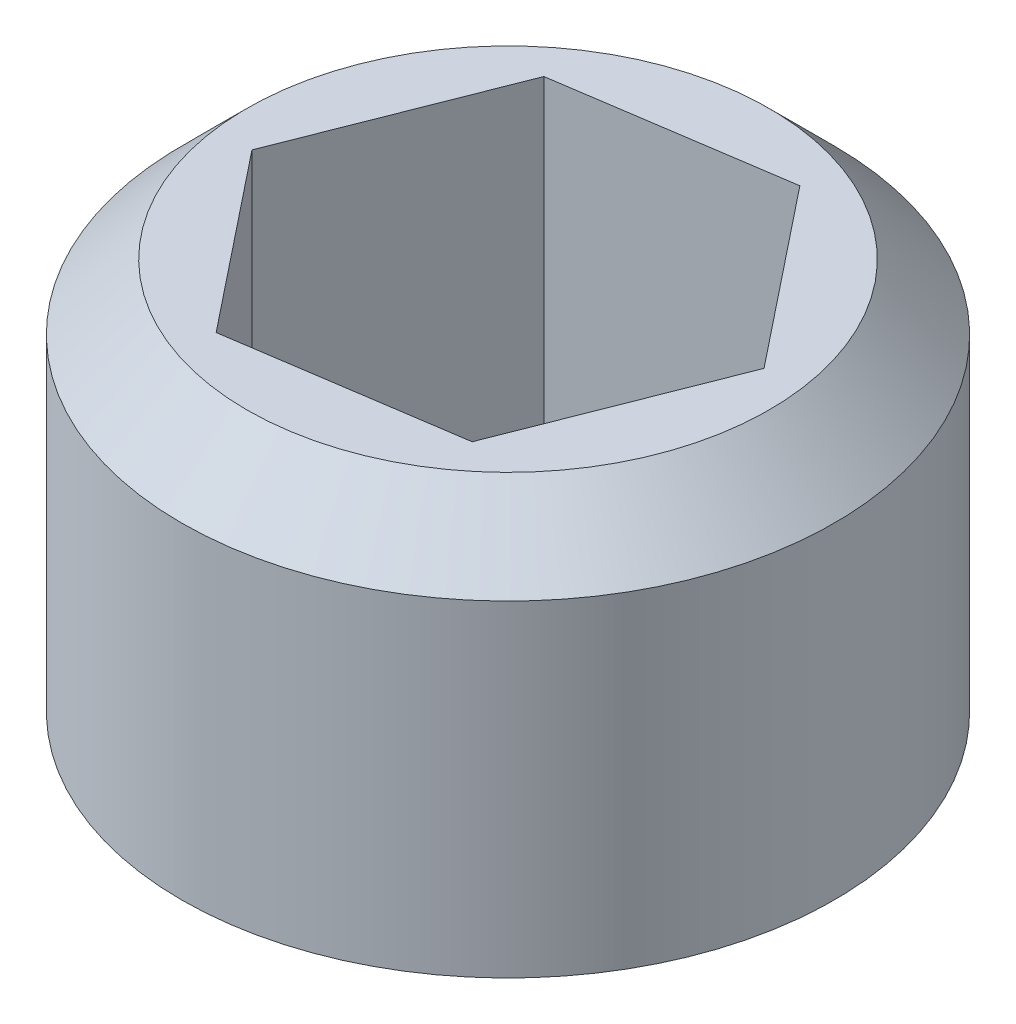
ISO-10303-21;
HEADER;
FILE_DESCRIPTION(('STEP AP214'),'2;1');
FILE_NAME('part.step','',(''),(''),'','','');
FILE_SCHEMA(('AUTOMOTIVE_DESIGN { 1 0 10303 214 1 1 1 1 }'));
ENDSEC;
DATA;
#1=APPLICATION_CONTEXT('core data for automotive mechanical design processes');
#2=APPLICATION_PROTOCOL_DEFINITION('international standard','automotive_design',2000,#1);
#3=PRODUCT_CONTEXT('',#1,'mechanical');
#4=PRODUCT('Part','Part','',(#3));
#5=PRODUCT_RELATED_PRODUCT_CATEGORY('part','',(#4));
#6=PRODUCT_DEFINITION_FORMATION('','',#4);
#7=PRODUCT_DEFINITION_CONTEXT('part definition',#1,'design');
#8=PRODUCT_DEFINITION('design','',#6,#7);
#9=PRODUCT_DEFINITION_SHAPE('','',#8);
#10=(LENGTH_UNIT() NAMED_UNIT(*) SI_UNIT(.MILLI.,.METRE.));
#11=(NAMED_UNIT(*) PLANE_ANGLE_UNIT() SI_UNIT($,.RADIAN.));
#12=(NAMED_UNIT(*) SI_UNIT($,.STERADIAN.) SOLID_ANGLE_UNIT());
#13=UNCERTAINTY_MEASURE_WITH_UNIT(LENGTH_MEASURE(1.E-05),#10,'distance_accuracy_value','');
#14=(GEOMETRIC_REPRESENTATION_CONTEXT(3) GLOBAL_UNCERTAINTY_ASSIGNED_CONTEXT((#13)) GLOBAL_UNIT_ASSIGNED_CONTEXT((#10,
#11,#12)) REPRESENTATION_CONTEXT('',''));
#15=CARTESIAN_POINT('',(0.,0.,0.));
#16=DIRECTION('',(0.,0.,1.));
#17=DIRECTION('',(1.,0.,0.));
#18=AXIS2_PLACEMENT_3D('',#15,#16,#17);
#19=CARTESIAN_POINT('',(0.,6.,0.));
#20=DIRECTION('',(0.,-1.,0.));
#21=DIRECTION('',(0.,0.,-1.));
#22=AXIS2_PLACEMENT_3D('',#19,#20,#21);
#23=CYLINDRICAL_SURFACE('',#22,5.);
#24=CARTESIAN_POINT('',(0.,5.,0.));
#25=DIRECTION('',(0.,1.,0.));
#26=DIRECTION('',(0.,0.,1.));
#27=AXIS2_PLACEMENT_3D('',#24,#25,#26);
#28=CIRCLE('',#27,5.);
#29=CARTESIAN_POINT('',(0.,5.,5.));
#30=VERTEX_POINT('',#29);
#31=EDGE_CURVE('E11',#30,#30,#28,.F.);
#32=ORIENTED_EDGE('',*,*,#31,.T.);
#33=EDGE_LOOP('',(#32));
#34=FACE_BOUND('',#33,.T.);
#35=CARTESIAN_POINT('',(0.,0.,0.));
#36=DIRECTION('',(0.,1.,0.));
#37=DIRECTION('',(0.,0.,1.));
#38=AXIS2_PLACEMENT_3D('',#35,#36,#37);
#39=CIRCLE('',#38,5.);
#40=CARTESIAN_POINT('',(0.,0.,5.));
#41=VERTEX_POINT('',#40);
#42=EDGE_CURVE('E134',#41,#41,#39,.T.);
#43=ORIENTED_EDGE('',*,*,#42,.T.);
#44=EDGE_LOOP('',(#43));
#45=FACE_BOUND('',#44,.T.);
#46=ADVANCED_FACE('F32',(#34,#45),#23,.T.);
#47=CARTESIAN_POINT('',(0.,6.,0.));
#48=DIRECTION('',(0.,1.,0.));
#49=DIRECTION('',(0.,0.,1.));
#50=AXIS2_PLACEMENT_3D('',#47,#48,#49);
#51=PLANE('',#50);
#52=CARTESIAN_POINT('',(0.,6.,0.));
#53=DIRECTION('',(0.,1.,0.));
#54=DIRECTION('',(0.,0.,1.));
#55=AXIS2_PLACEMENT_3D('',#52,#53,#54);
#56=CIRCLE('',#55,4.00000000000001);
#57=CARTESIAN_POINT('',(0.,6.,4.00000000000001));
#58=VERTEX_POINT('',#57);
#59=EDGE_CURVE('E40',#58,#58,#56,.T.);
#60=ORIENTED_EDGE('',*,*,#59,.T.);
#61=EDGE_LOOP('',(#60));
#62=FACE_BOUND('',#61,.T.);
#63=DIRECTION('',(-0.623021450460397,0.,-0.782204750858893));
#64=VECTOR('',#63,1.);
#65=CARTESIAN_POINT('',(3.40957319628615,6.,-0.511822272297437));
#66=LINE('',#65,#64);
#67=CARTESIAN_POINT('',(3.40957319628615,6.,-0.511822272297437));
#68=VERTEX_POINT('',#67);
#69=CARTESIAN_POINT('',(1.26153550811082,6.,-3.20868814019503));
#70=VERTEX_POINT('',#69);
#71=EDGE_CURVE('E47',#68,#70,#66,.T.);
#72=ORIENTED_EDGE('',*,*,#71,.F.);
#73=DIRECTION('',(0.36589845997448,0.,-0.930654778630779));
#74=VECTOR('',#73,1.);
#75=CARTESIAN_POINT('',(2.14803768817533,6.,2.69686586789759));
#76=LINE('',#75,#74);
#77=CARTESIAN_POINT('',(2.14803768817533,6.,2.69686586789759));
#78=VERTEX_POINT('',#77);
#79=EDGE_CURVE('E130',#78,#68,#76,.T.);
#80=ORIENTED_EDGE('',*,*,#79,.F.);
#81=DIRECTION('',(0.988919910434878,0.,-0.148450027771886));
#82=VECTOR('',#81,1.);
#83=CARTESIAN_POINT('',(-1.26153550811082,6.,3.20868814019503));
#84=LINE('',#83,#82);
#85=CARTESIAN_POINT('',(-1.26153550811082,6.,3.20868814019503));
#86=VERTEX_POINT('',#85);
#87=EDGE_CURVE('E128',#86,#78,#84,.T.);
#88=ORIENTED_EDGE('',*,*,#87,.F.);
#89=DIRECTION('',(0.623021450460398,0.,0.782204750858893));
#90=VECTOR('',#89,1.);
#91=CARTESIAN_POINT('',(-3.40957319628615,6.,0.511822272297437));
#92=LINE('',#91,#90);
#93=CARTESIAN_POINT('',(-3.40957319628615,6.,0.511822272297437));
#94=VERTEX_POINT('',#93);
#95=EDGE_CURVE('E95',#94,#86,#92,.T.);
#96=ORIENTED_EDGE('',*,*,#95,.F.);
#97=DIRECTION('',(-0.36589845997448,0.,0.930654778630779));
#98=VECTOR('',#97,1.);
#99=CARTESIAN_POINT('',(-2.14803768817533,6.,-2.69686586789759));
#100=LINE('',#99,#98);
#101=CARTESIAN_POINT('',(-2.14803768817533,6.,-2.69686586789759));
#102=VERTEX_POINT('',#101);
#103=EDGE_CURVE('E124',#102,#94,#100,.T.);
#104=ORIENTED_EDGE('',*,*,#103,.F.);
#105=DIRECTION('',(-0.988919910434878,0.,0.148450027771886));
#106=VECTOR('',#105,1.);
#107=CARTESIAN_POINT('',(1.26153550811082,6.,-3.20868814019503));
#108=LINE('',#107,#106);
#109=EDGE_CURVE('E121',#70,#102,#108,.T.);
#110=ORIENTED_EDGE('',*,*,#109,.F.);
#111=EDGE_LOOP('',(#72,#80,#88,#96,#104,#110));
#112=FACE_BOUND('',#111,.T.);
#113=ADVANCED_FACE('F144',(#62,#112),#51,.T.);
#114=CARTESIAN_POINT('',(0.,0.,0.));
#115=DIRECTION('',(0.,1.,0.));
#116=DIRECTION('',(0.,0.,1.));
#117=AXIS2_PLACEMENT_3D('',#114,#115,#116);
#118=PLANE('',#117);
#119=ORIENTED_EDGE('',*,*,#42,.F.);
#120=EDGE_LOOP('',(#119));
#121=FACE_BOUND('',#120,.T.);
#122=ADVANCED_FACE('F160',(#121),#118,.F.);
#123=CARTESIAN_POINT('',(3.40957319628615,1.,-0.511822272297437));
#124=DIRECTION('',(0.782204750858893,0.,-0.623021450460397));
#125=DIRECTION('',(-0.623021450460397,0.,-0.782204750858893));
#126=AXIS2_PLACEMENT_3D('',#123,#124,#125);
#127=PLANE('',#126);
#128=ORIENTED_EDGE('',*,*,#71,.T.);
#129=DIRECTION('',(0.,1.,0.));
#130=VECTOR('',#129,1.);
#131=CARTESIAN_POINT('',(1.26153550811082,1.,-3.20868814019503));
#132=LINE('',#131,#130);
#133=CARTESIAN_POINT('',(1.26153550811082,1.,-3.20868814019503));
#134=VERTEX_POINT('',#133);
#135=EDGE_CURVE('E77',#134,#70,#132,.T.);
#136=ORIENTED_EDGE('',*,*,#135,.F.);
#137=DIRECTION('',(-0.623021450460397,0.,-0.782204750858893));
#138=VECTOR('',#137,1.);
#139=CARTESIAN_POINT('',(3.40957319628615,1.,-0.511822272297437));
#140=LINE('',#139,#138);
#141=CARTESIAN_POINT('',(3.40957319628615,1.,-0.511822272297437));
#142=VERTEX_POINT('',#141);
#143=EDGE_CURVE('E132',#142,#134,#140,.T.);
#144=ORIENTED_EDGE('',*,*,#143,.F.);
#145=DIRECTION('',(0.,1.,0.));
#146=VECTOR('',#145,1.);
#147=CARTESIAN_POINT('',(3.40957319628615,1.,-0.511822272297437));
#148=LINE('',#147,#146);
#149=EDGE_CURVE('E55',#142,#68,#148,.T.);
#150=ORIENTED_EDGE('',*,*,#149,.T.);
#151=EDGE_LOOP('',(#128,#136,#144,#150));
#152=FACE_BOUND('',#151,.T.);
#153=ADVANCED_FACE('F165',(#152),#127,.F.);
#154=CARTESIAN_POINT('',(2.14803768817533,1.,2.69686586789759));
#155=DIRECTION('',(0.930654778630779,0.,0.36589845997448));
#156=DIRECTION('',(0.36589845997448,0.,-0.930654778630779));
#157=AXIS2_PLACEMENT_3D('',#154,#155,#156);
#158=PLANE('',#157);
#159=ORIENTED_EDGE('',*,*,#79,.T.);
#160=ORIENTED_EDGE('',*,*,#149,.F.);
#161=DIRECTION('',(0.36589845997448,0.,-0.930654778630779));
#162=VECTOR('',#161,1.);
#163=CARTESIAN_POINT('',(2.14803768817533,1.,2.69686586789759));
#164=LINE('',#163,#162);
#165=CARTESIAN_POINT('',(2.14803768817533,1.,2.69686586789759));
#166=VERTEX_POINT('',#165);
#167=EDGE_CURVE('E107',#166,#142,#164,.T.);
#168=ORIENTED_EDGE('',*,*,#167,.F.);
#169=DIRECTION('',(0.,1.,0.));
#170=VECTOR('',#169,1.);
#171=CARTESIAN_POINT('',(2.14803768817533,1.,2.69686586789759));
#172=LINE('',#171,#170);
#173=EDGE_CURVE('E99',#166,#78,#172,.T.);
#174=ORIENTED_EDGE('',*,*,#173,.T.);
#175=EDGE_LOOP('',(#159,#160,#168,#174));
#176=FACE_BOUND('',#175,.T.);
#177=ADVANCED_FACE('F170',(#176),#158,.F.);
#178=CARTESIAN_POINT('',(-1.26153550811082,1.,3.20868814019503));
#179=DIRECTION('',(0.148450027771886,0.,0.988919910434878));
#180=DIRECTION('',(0.988919910434878,0.,-0.148450027771886));
#181=AXIS2_PLACEMENT_3D('',#178,#179,#180);
#182=PLANE('',#181);
#183=ORIENTED_EDGE('',*,*,#87,.T.);
#184=ORIENTED_EDGE('',*,*,#173,.F.);
#185=DIRECTION('',(0.988919910434878,0.,-0.148450027771886));
#186=VECTOR('',#185,1.);
#187=CARTESIAN_POINT('',(-1.26153550811082,1.,3.20868814019503));
#188=LINE('',#187,#186);
#189=CARTESIAN_POINT('',(-1.26153550811082,1.,3.20868814019503));
#190=VERTEX_POINT('',#189);
#191=EDGE_CURVE('E103',#190,#166,#188,.T.);
#192=ORIENTED_EDGE('',*,*,#191,.F.);
#193=DIRECTION('',(0.,1.,0.));
#194=VECTOR('',#193,1.);
#195=CARTESIAN_POINT('',(-1.26153550811082,1.,3.20868814019503));
#196=LINE('',#195,#194);
#197=EDGE_CURVE('E88',#190,#86,#196,.T.);
#198=ORIENTED_EDGE('',*,*,#197,.T.);
#199=EDGE_LOOP('',(#183,#184,#192,#198));
#200=FACE_BOUND('',#199,.T.);
#201=ADVANCED_FACE('F104',(#200),#182,.F.);
#202=CARTESIAN_POINT('',(-3.40957319628615,1.,0.511822272297437));
#203=DIRECTION('',(-0.782204750858893,0.,0.623021450460398));
#204=DIRECTION('',(0.623021450460398,0.,0.782204750858893));
#205=AXIS2_PLACEMENT_3D('',#202,#203,#204);
#206=PLANE('',#205);
#207=ORIENTED_EDGE('',*,*,#95,.T.);
#208=ORIENTED_EDGE('',*,*,#197,.F.);
#209=DIRECTION('',(0.623021450460398,0.,0.782204750858893));
#210=VECTOR('',#209,1.);
#211=CARTESIAN_POINT('',(-3.40957319628615,1.,0.511822272297437));
#212=LINE('',#211,#210);
#213=CARTESIAN_POINT('',(-3.40957319628615,1.,0.511822272297437));
#214=VERTEX_POINT('',#213);
#215=EDGE_CURVE('E92',#214,#190,#212,.T.);
#216=ORIENTED_EDGE('',*,*,#215,.F.);
#217=DIRECTION('',(0.,1.,0.));
#218=VECTOR('',#217,1.);
#219=CARTESIAN_POINT('',(-3.40957319628615,1.,0.511822272297437));
#220=LINE('',#219,#218);
#221=EDGE_CURVE('E100',#214,#94,#220,.T.);
#222=ORIENTED_EDGE('',*,*,#221,.T.);
#223=EDGE_LOOP('',(#207,#208,#216,#222));
#224=FACE_BOUND('',#223,.T.);
#225=ADVANCED_FACE('F90',(#224),#206,.F.);
#226=CARTESIAN_POINT('',(-2.14803768817533,1.,-2.69686586789759));
#227=DIRECTION('',(-0.930654778630779,0.,-0.36589845997448));
#228=DIRECTION('',(-0.36589845997448,0.,0.930654778630779));
#229=AXIS2_PLACEMENT_3D('',#226,#227,#228);
#230=PLANE('',#229);
#231=ORIENTED_EDGE('',*,*,#103,.T.);
#232=ORIENTED_EDGE('',*,*,#221,.F.);
#233=DIRECTION('',(-0.36589845997448,0.,0.930654778630779));
#234=VECTOR('',#233,1.);
#235=CARTESIAN_POINT('',(-2.14803768817533,1.,-2.69686586789759));
#236=LINE('',#235,#234);
#237=CARTESIAN_POINT('',(-2.14803768817533,1.,-2.69686586789759));
#238=VERTEX_POINT('',#237);
#239=EDGE_CURVE('E113',#238,#214,#236,.T.);
#240=ORIENTED_EDGE('',*,*,#239,.F.);
#241=DIRECTION('',(0.,1.,0.));
#242=VECTOR('',#241,1.);
#243=CARTESIAN_POINT('',(-2.14803768817533,1.,-2.69686586789759));
#244=LINE('',#243,#242);
#245=EDGE_CURVE('E137',#238,#102,#244,.T.);
#246=ORIENTED_EDGE('',*,*,#245,.T.);
#247=EDGE_LOOP('',(#231,#232,#240,#246));
#248=FACE_BOUND('',#247,.T.);
#249=ADVANCED_FACE('F173',(#248),#230,.F.);
#250=CARTESIAN_POINT('',(1.26153550811082,1.,-3.20868814019503));
#251=DIRECTION('',(-0.148450027771886,0.,-0.988919910434878));
#252=DIRECTION('',(-0.988919910434878,0.,0.148450027771886));
#253=AXIS2_PLACEMENT_3D('',#250,#251,#252);
#254=PLANE('',#253);
#255=ORIENTED_EDGE('',*,*,#109,.T.);
#256=ORIENTED_EDGE('',*,*,#245,.F.);
#257=DIRECTION('',(-0.988919910434878,0.,0.148450027771886));
#258=VECTOR('',#257,1.);
#259=CARTESIAN_POINT('',(1.26153550811082,1.,-3.20868814019503));
#260=LINE('',#259,#258);
#261=EDGE_CURVE('E115',#134,#238,#260,.T.);
#262=ORIENTED_EDGE('',*,*,#261,.F.);
#263=ORIENTED_EDGE('',*,*,#135,.T.);
#264=EDGE_LOOP('',(#255,#256,#262,#263));
#265=FACE_BOUND('',#264,.T.);
#266=ADVANCED_FACE('F152',(#265),#254,.F.);
#267=CARTESIAN_POINT('',(1.26153550811082,1.,-3.20868814019503));
#268=DIRECTION('',(0.,1.,0.));
#269=DIRECTION('',(0.,0.,1.));
#270=AXIS2_PLACEMENT_3D('',#267,#268,#269);
#271=PLANE('',#270);
#272=ORIENTED_EDGE('',*,*,#143,.T.);
#273=ORIENTED_EDGE('',*,*,#261,.T.);
#274=ORIENTED_EDGE('',*,*,#239,.T.);
#275=ORIENTED_EDGE('',*,*,#215,.T.);
#276=ORIENTED_EDGE('',*,*,#191,.T.);
#277=ORIENTED_EDGE('',*,*,#167,.T.);
#278=EDGE_LOOP('',(#272,#273,#274,#275,#276,#277));
#279=FACE_BOUND('',#278,.T.);
#280=ADVANCED_FACE('F110',(#279),#271,.T.);
#281=CARTESIAN_POINT('',(0.,6.,0.));
#282=DIRECTION('',(0.,-1.,0.));
#283=DIRECTION('',(0.,0.,-1.));
#284=AXIS2_PLACEMENT_3D('',#281,#282,#283);
#285=CONICAL_SURFACE('',#284,4.00000000000001,0.785398163397447);
#286=ORIENTED_EDGE('',*,*,#31,.F.);
#287=EDGE_LOOP('',(#286));
#288=FACE_BOUND('',#287,.T.);
#289=ORIENTED_EDGE('',*,*,#59,.F.);
#290=EDGE_LOOP('',(#289));
#291=FACE_BOUND('',#290,.T.);
#292=ADVANCED_FACE('F34',(#288,#291),#285,.T.);
#293=CLOSED_SHELL('',(#46,#113,#122,#153,#177,#201,#225,#249,#266,#280,#292));
#294=MANIFOLD_SOLID_BREP('B2',#293);
#295=ADVANCED_BREP_SHAPE_REPRESENTATION('',(#18,#294),#14);
#296=SHAPE_DEFINITION_REPRESENTATION(#9,#295);
ENDSEC;
END-ISO-10303-21;
